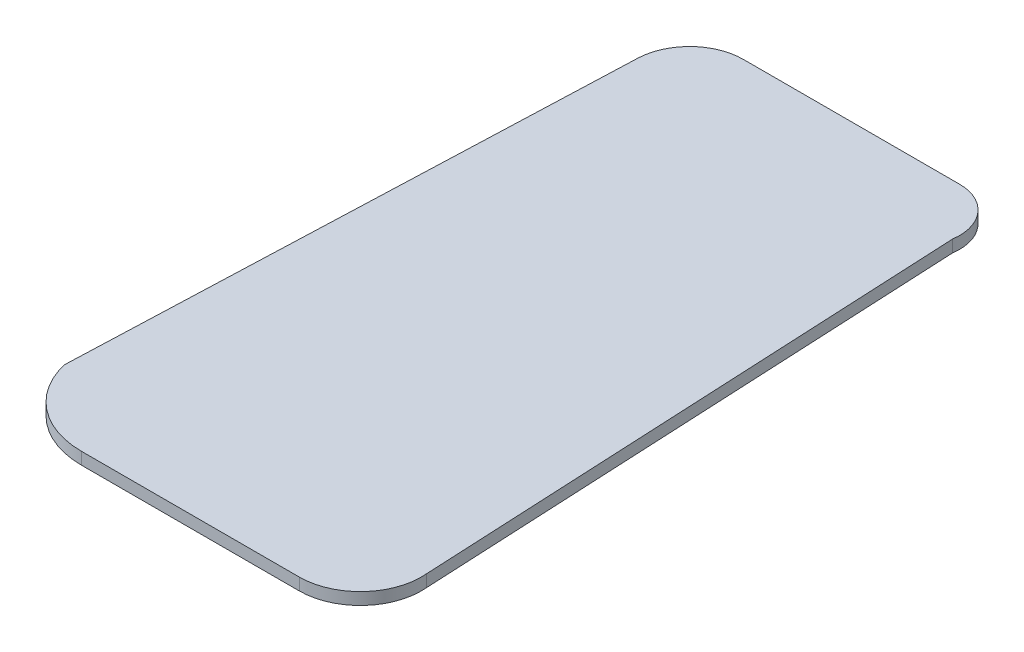
ISO-10303-21;
HEADER;
FILE_DESCRIPTION(('STEP AP214'),'2;1');
FILE_NAME('part.step','',(''),(''),'','','');
FILE_SCHEMA(('AUTOMOTIVE_DESIGN { 1 0 10303 214 1 1 1 1 }'));
ENDSEC;
DATA;
#1=APPLICATION_CONTEXT('core data for automotive mechanical design processes');
#2=APPLICATION_PROTOCOL_DEFINITION('international standard','automotive_design',2000,#1);
#3=PRODUCT_CONTEXT('',#1,'mechanical');
#4=PRODUCT('Part','Part','',(#3));
#5=PRODUCT_RELATED_PRODUCT_CATEGORY('part','',(#4));
#6=PRODUCT_DEFINITION_FORMATION('','',#4);
#7=PRODUCT_DEFINITION_CONTEXT('part definition',#1,'design');
#8=PRODUCT_DEFINITION('design','',#6,#7);
#9=PRODUCT_DEFINITION_SHAPE('','',#8);
#10=(LENGTH_UNIT() NAMED_UNIT(*) SI_UNIT(.MILLI.,.METRE.));
#11=(NAMED_UNIT(*) PLANE_ANGLE_UNIT() SI_UNIT($,.RADIAN.));
#12=(NAMED_UNIT(*) SI_UNIT($,.STERADIAN.) SOLID_ANGLE_UNIT());
#13=UNCERTAINTY_MEASURE_WITH_UNIT(LENGTH_MEASURE(1.E-05),#10,'distance_accuracy_value','');
#14=(GEOMETRIC_REPRESENTATION_CONTEXT(3) GLOBAL_UNCERTAINTY_ASSIGNED_CONTEXT((#13)) GLOBAL_UNIT_ASSIGNED_CONTEXT((#10,
#11,#12)) REPRESENTATION_CONTEXT('',''));
#15=CARTESIAN_POINT('',(0.,0.,0.));
#16=DIRECTION('',(0.,0.,1.));
#17=DIRECTION('',(1.,0.,0.));
#18=AXIS2_PLACEMENT_3D('',#15,#16,#17);
#19=CARTESIAN_POINT('',(24.8187686559189,2.54,-21.4184403435667));
#20=DIRECTION('',(0.,-1.,0.));
#21=DIRECTION('',(0.,0.,-1.));
#22=AXIS2_PLACEMENT_3D('',#19,#20,#21);
#23=CYLINDRICAL_SURFACE('',#22,18.0381220267883);
#24=CARTESIAN_POINT('',(24.8187686559189,0.,-21.4184403435667));
#25=DIRECTION('',(0.,1.,0.));
#26=DIRECTION('',(0.,0.,-1.));
#27=AXIS2_PLACEMENT_3D('',#24,#25,#26);
#28=CIRCLE('',#27,18.0381220267883);
#29=CARTESIAN_POINT('',(7.23714743262047,0.,-17.3860165794059));
#30=VERTEX_POINT('',#29);
#31=CARTESIAN_POINT('',(24.8187686559189,0.,-3.38031831677837));
#32=VERTEX_POINT('',#31);
#33=EDGE_CURVE('E191',#30,#32,#28,.T.);
#34=ORIENTED_EDGE('',*,*,#33,.T.);
#35=DIRECTION('',(0.,-1.,0.));
#36=VECTOR('',#35,1.);
#37=CARTESIAN_POINT('',(24.8187686559189,2.54,-3.38031831677837));
#38=LINE('',#37,#36);
#39=CARTESIAN_POINT('',(24.8187686559189,2.54,-3.38031831677837));
#40=VERTEX_POINT('',#39);
#41=EDGE_CURVE('E12',#40,#32,#38,.T.);
#42=ORIENTED_EDGE('',*,*,#41,.F.);
#43=CARTESIAN_POINT('',(24.8187686559189,2.54,-21.4184403435667));
#44=DIRECTION('',(0.,1.,0.));
#45=DIRECTION('',(0.,0.,-1.));
#46=AXIS2_PLACEMENT_3D('',#43,#44,#45);
#47=CIRCLE('',#46,18.0381220267883);
#48=CARTESIAN_POINT('',(7.23714743262047,2.54,-17.3860165794059));
#49=VERTEX_POINT('',#48);
#50=EDGE_CURVE('E156',#49,#40,#47,.T.);
#51=ORIENTED_EDGE('',*,*,#50,.F.);
#52=DIRECTION('',(0.,-1.,0.));
#53=VECTOR('',#52,1.);
#54=CARTESIAN_POINT('',(7.23714743262047,2.54,-17.3860165794059));
#55=LINE('',#54,#53);
#56=EDGE_CURVE('E131',#49,#30,#55,.T.);
#57=ORIENTED_EDGE('',*,*,#56,.T.);
#58=EDGE_LOOP('',(#34,#42,#51,#57));
#59=FACE_BOUND('',#58,.T.);
#60=ADVANCED_FACE('F36',(#59),#23,.T.);
#61=CARTESIAN_POINT('',(70.7097799845283,2.54,-3.38031831677837));
#62=DIRECTION('',(0.,0.,-1.));
#63=DIRECTION('',(-1.,0.,0.));
#64=AXIS2_PLACEMENT_3D('',#61,#62,#63);
#65=PLANE('',#64);
#66=DIRECTION('',(1.,0.,0.));
#67=VECTOR('',#66,1.);
#68=CARTESIAN_POINT('',(70.7097799845283,0.,-3.38031831677837));
#69=LINE('',#68,#67);
#70=CARTESIAN_POINT('',(70.7097799845283,0.,-3.38031831677836));
#71=VERTEX_POINT('',#70);
#72=EDGE_CURVE('E185',#32,#71,#69,.T.);
#73=ORIENTED_EDGE('',*,*,#72,.T.);
#74=DIRECTION('',(0.,-1.,0.));
#75=VECTOR('',#74,1.);
#76=CARTESIAN_POINT('',(70.7097799845283,2.54,-3.38031831677836));
#77=LINE('',#76,#75);
#78=CARTESIAN_POINT('',(70.7097799845283,2.54,-3.38031831677836));
#79=VERTEX_POINT('',#78);
#80=EDGE_CURVE('E44',#79,#71,#77,.T.);
#81=ORIENTED_EDGE('',*,*,#80,.F.);
#82=DIRECTION('',(1.,0.,0.));
#83=VECTOR('',#82,1.);
#84=CARTESIAN_POINT('',(70.7097799845283,2.54,-3.38031831677837));
#85=LINE('',#84,#83);
#86=EDGE_CURVE('E95',#40,#79,#85,.T.);
#87=ORIENTED_EDGE('',*,*,#86,.F.);
#88=ORIENTED_EDGE('',*,*,#41,.T.);
#89=EDGE_LOOP('',(#73,#81,#87,#88));
#90=FACE_BOUND('',#89,.T.);
#91=ADVANCED_FACE('F210',(#90),#65,.F.);
#92=CARTESIAN_POINT('',(70.7097799845283,2.54,-16.2447645706812));
#93=DIRECTION('',(0.,-1.,0.));
#94=DIRECTION('',(0.,0.,-1.));
#95=AXIS2_PLACEMENT_3D('',#92,#93,#94);
#96=CYLINDRICAL_SURFACE('',#95,12.8644462539028);
#97=CARTESIAN_POINT('',(70.7097799845283,0.,-16.2447645706812));
#98=DIRECTION('',(0.,1.,0.));
#99=DIRECTION('',(0.,0.,1.));
#100=AXIS2_PLACEMENT_3D('',#97,#98,#99);
#101=CIRCLE('',#100,12.8644462539028);
#102=CARTESIAN_POINT('',(83.5235039269322,0.,-17.3860165794059));
#103=VERTEX_POINT('',#102);
#104=EDGE_CURVE('E180',#71,#103,#101,.T.);
#105=ORIENTED_EDGE('',*,*,#104,.T.);
#106=DIRECTION('',(0.,-1.,0.));
#107=VECTOR('',#106,1.);
#108=CARTESIAN_POINT('',(83.5235039269322,2.54,-17.3860165794059));
#109=LINE('',#108,#107);
#110=CARTESIAN_POINT('',(83.5235039269322,2.54,-17.3860165794059));
#111=VERTEX_POINT('',#110);
#112=EDGE_CURVE('E172',#111,#103,#109,.T.);
#113=ORIENTED_EDGE('',*,*,#112,.F.);
#114=CARTESIAN_POINT('',(70.7097799845283,2.54,-16.2447645706812));
#115=DIRECTION('',(0.,1.,0.));
#116=DIRECTION('',(0.,0.,1.));
#117=AXIS2_PLACEMENT_3D('',#114,#115,#116);
#118=CIRCLE('',#117,12.8644462539028);
#119=EDGE_CURVE('E148',#79,#111,#118,.T.);
#120=ORIENTED_EDGE('',*,*,#119,.F.);
#121=ORIENTED_EDGE('',*,*,#80,.T.);
#122=EDGE_LOOP('',(#105,#113,#120,#121));
#123=FACE_BOUND('',#122,.T.);
#124=ADVANCED_FACE('F178',(#123),#96,.T.);
#125=CARTESIAN_POINT('',(77.86162590587,2.54,-133.901506381265));
#126=DIRECTION('',(-0.998821429969185,0.,0.0485360797171728));
#127=DIRECTION('',(0.0485360797171728,0.,0.998821429969185));
#128=AXIS2_PLACEMENT_3D('',#125,#126,#127);
#129=PLANE('',#128);
#130=DIRECTION('',(-0.0485360797171728,0.,-0.998821429969185));
#131=VECTOR('',#130,1.);
#132=CARTESIAN_POINT('',(77.86162590587,0.,-133.901506381265));
#133=LINE('',#132,#131);
#134=CARTESIAN_POINT('',(77.86162590587,0.,-133.901506381265));
#135=VERTEX_POINT('',#134);
#136=EDGE_CURVE('E187',#103,#135,#133,.T.);
#137=ORIENTED_EDGE('',*,*,#136,.T.);
#138=DIRECTION('',(0.,-1.,0.));
#139=VECTOR('',#138,1.);
#140=CARTESIAN_POINT('',(77.86162590587,2.54,-133.901506381265));
#141=LINE('',#140,#139);
#142=CARTESIAN_POINT('',(77.86162590587,2.54,-133.901506381265));
#143=VERTEX_POINT('',#142);
#144=EDGE_CURVE('E169',#143,#135,#141,.T.);
#145=ORIENTED_EDGE('',*,*,#144,.F.);
#146=DIRECTION('',(-0.0485360797171728,0.,-0.998821429969185));
#147=VECTOR('',#146,1.);
#148=CARTESIAN_POINT('',(77.86162590587,2.54,-133.901506381265));
#149=LINE('',#148,#147);
#150=EDGE_CURVE('E144',#111,#143,#149,.T.);
#151=ORIENTED_EDGE('',*,*,#150,.F.);
#152=ORIENTED_EDGE('',*,*,#112,.T.);
#153=EDGE_LOOP('',(#137,#145,#151,#152));
#154=FACE_BOUND('',#153,.T.);
#155=ADVANCED_FACE('F217',(#154),#129,.F.);
#156=CARTESIAN_POINT('',(68.623824924137,2.54,-135.28800428847));
#157=DIRECTION('',(0.,-1.,0.));
#158=DIRECTION('',(0.,0.,-1.));
#159=AXIS2_PLACEMENT_3D('',#156,#157,#158);
#160=CYLINDRICAL_SURFACE('',#159,9.34127097480801);
#161=CARTESIAN_POINT('',(68.623824924137,0.,-135.28800428847));
#162=DIRECTION('',(0.,1.,0.));
#163=DIRECTION('',(0.,0.,-1.));
#164=AXIS2_PLACEMENT_3D('',#161,#162,#163);
#165=CIRCLE('',#164,9.34127097480801);
#166=CARTESIAN_POINT('',(68.623824924137,0.,-144.629275263278));
#167=VERTEX_POINT('',#166);
#168=EDGE_CURVE('E189',#135,#167,#165,.T.);
#169=ORIENTED_EDGE('',*,*,#168,.T.);
#170=DIRECTION('',(0.,-1.,0.));
#171=VECTOR('',#170,1.);
#172=CARTESIAN_POINT('',(68.623824924137,2.54,-144.629275263278));
#173=LINE('',#172,#171);
#174=CARTESIAN_POINT('',(68.623824924137,2.54,-144.629275263278));
#175=VERTEX_POINT('',#174);
#176=EDGE_CURVE('E124',#175,#167,#173,.T.);
#177=ORIENTED_EDGE('',*,*,#176,.F.);
#178=CARTESIAN_POINT('',(68.623824924137,2.54,-135.28800428847));
#179=DIRECTION('',(0.,1.,0.));
#180=DIRECTION('',(0.,0.,-1.));
#181=AXIS2_PLACEMENT_3D('',#178,#179,#180);
#182=CIRCLE('',#181,9.34127097480801);
#183=EDGE_CURVE('E114',#143,#175,#182,.T.);
#184=ORIENTED_EDGE('',*,*,#183,.F.);
#185=ORIENTED_EDGE('',*,*,#144,.T.);
#186=EDGE_LOOP('',(#169,#177,#184,#185));
#187=FACE_BOUND('',#186,.T.);
#188=ADVANCED_FACE('F195',(#187),#160,.T.);
#189=CARTESIAN_POINT('',(23.0308071755835,2.54,-144.629275263278));
#190=DIRECTION('',(0.,0.,1.));
#191=DIRECTION('',(1.,0.,0.));
#192=AXIS2_PLACEMENT_3D('',#189,#190,#191);
#193=PLANE('',#192);
#194=DIRECTION('',(-1.,0.,0.));
#195=VECTOR('',#194,1.);
#196=CARTESIAN_POINT('',(23.0308071755835,0.,-144.629275263278));
#197=LINE('',#196,#195);
#198=CARTESIAN_POINT('',(23.0308071755835,0.,-144.629275263278));
#199=VERTEX_POINT('',#198);
#200=EDGE_CURVE('E123',#167,#199,#197,.T.);
#201=ORIENTED_EDGE('',*,*,#200,.T.);
#202=DIRECTION('',(0.,-1.,0.));
#203=VECTOR('',#202,1.);
#204=CARTESIAN_POINT('',(23.0308071755835,2.54,-144.629275263278));
#205=LINE('',#204,#203);
#206=CARTESIAN_POINT('',(23.0308071755835,2.54,-144.629275263278));
#207=VERTEX_POINT('',#206);
#208=EDGE_CURVE('E120',#207,#199,#205,.T.);
#209=ORIENTED_EDGE('',*,*,#208,.F.);
#210=DIRECTION('',(-1.,0.,0.));
#211=VECTOR('',#210,1.);
#212=CARTESIAN_POINT('',(23.0308071755835,2.54,-144.629275263278));
#213=LINE('',#212,#211);
#214=EDGE_CURVE('E108',#175,#207,#213,.T.);
#215=ORIENTED_EDGE('',*,*,#214,.F.);
#216=ORIENTED_EDGE('',*,*,#176,.T.);
#217=EDGE_LOOP('',(#201,#209,#215,#216));
#218=FACE_BOUND('',#217,.T.);
#219=ADVANCED_FACE('F121',(#218),#193,.F.);
#220=CARTESIAN_POINT('',(23.0308071755835,2.54,-133.288964022261));
#221=DIRECTION('',(0.,-1.,0.));
#222=DIRECTION('',(0.,0.,-1.));
#223=AXIS2_PLACEMENT_3D('',#220,#221,#222);
#224=CYLINDRICAL_SURFACE('',#223,11.3403112410164);
#225=CARTESIAN_POINT('',(23.0308071755835,0.,-133.288964022261));
#226=DIRECTION('',(0.,1.,0.));
#227=DIRECTION('',(0.,0.,1.));
#228=AXIS2_PLACEMENT_3D('',#225,#226,#227);
#229=CIRCLE('',#228,11.3403112410164);
#230=CARTESIAN_POINT('',(11.707051133459,0.,-133.901506381265));
#231=VERTEX_POINT('',#230);
#232=EDGE_CURVE('E81',#199,#231,#229,.T.);
#233=ORIENTED_EDGE('',*,*,#232,.T.);
#234=DIRECTION('',(0.,-1.,0.));
#235=VECTOR('',#234,1.);
#236=CARTESIAN_POINT('',(11.707051133459,2.54,-133.901506381265));
#237=LINE('',#236,#235);
#238=CARTESIAN_POINT('',(11.707051133459,2.54,-133.901506381265));
#239=VERTEX_POINT('',#238);
#240=EDGE_CURVE('E125',#239,#231,#237,.T.);
#241=ORIENTED_EDGE('',*,*,#240,.F.);
#242=CARTESIAN_POINT('',(23.0308071755835,2.54,-133.288964022261));
#243=DIRECTION('',(0.,1.,0.));
#244=DIRECTION('',(0.,0.,1.));
#245=AXIS2_PLACEMENT_3D('',#242,#243,#244);
#246=CIRCLE('',#245,11.3403112410164);
#247=EDGE_CURVE('E112',#207,#239,#246,.T.);
#248=ORIENTED_EDGE('',*,*,#247,.F.);
#249=ORIENTED_EDGE('',*,*,#208,.T.);
#250=EDGE_LOOP('',(#233,#241,#248,#249));
#251=FACE_BOUND('',#250,.T.);
#252=ADVANCED_FACE('F127',(#251),#224,.T.);
#253=CARTESIAN_POINT('',(7.23714743262047,2.54,-17.3860165794059));
#254=DIRECTION('',(0.999264944796044,0.,0.0383349723067536));
#255=DIRECTION('',(0.0383349723067536,0.,-0.999264944796044));
#256=AXIS2_PLACEMENT_3D('',#253,#254,#255);
#257=PLANE('',#256);
#258=DIRECTION('',(-0.0383349723067536,0.,0.999264944796044));
#259=VECTOR('',#258,1.);
#260=CARTESIAN_POINT('',(7.23714743262047,0.,-17.3860165794059));
#261=LINE('',#260,#259);
#262=EDGE_CURVE('E87',#231,#30,#261,.T.);
#263=ORIENTED_EDGE('',*,*,#262,.T.);
#264=ORIENTED_EDGE('',*,*,#56,.F.);
#265=DIRECTION('',(-0.0383349723067536,0.,0.999264944796044));
#266=VECTOR('',#265,1.);
#267=CARTESIAN_POINT('',(7.23714743262047,2.54,-17.3860165794059));
#268=LINE('',#267,#266);
#269=EDGE_CURVE('E52',#239,#49,#268,.T.);
#270=ORIENTED_EDGE('',*,*,#269,.F.);
#271=ORIENTED_EDGE('',*,*,#240,.T.);
#272=EDGE_LOOP('',(#263,#264,#270,#271));
#273=FACE_BOUND('',#272,.T.);
#274=ADVANCED_FACE('F199',(#273),#257,.F.);
#275=CARTESIAN_POINT('',(24.8187686559189,2.54,-21.4184403435667));
#276=DIRECTION('',(0.,-1.,0.));
#277=DIRECTION('',(0.,0.,-1.));
#278=AXIS2_PLACEMENT_3D('',#275,#276,#277);
#279=PLANE('',#278);
#280=ORIENTED_EDGE('',*,*,#50,.T.);
#281=ORIENTED_EDGE('',*,*,#86,.T.);
#282=ORIENTED_EDGE('',*,*,#119,.T.);
#283=ORIENTED_EDGE('',*,*,#150,.T.);
#284=ORIENTED_EDGE('',*,*,#183,.T.);
#285=ORIENTED_EDGE('',*,*,#214,.T.);
#286=ORIENTED_EDGE('',*,*,#247,.T.);
#287=ORIENTED_EDGE('',*,*,#269,.T.);
#288=EDGE_LOOP('',(#280,#281,#282,#283,#284,#285,#286,#287));
#289=FACE_BOUND('',#288,.T.);
#290=ADVANCED_FACE('F110',(#289),#279,.F.);
#291=CARTESIAN_POINT('',(24.8187686559189,0.,-21.4184403435667));
#292=DIRECTION('',(0.,-1.,0.));
#293=DIRECTION('',(0.,0.,-1.));
#294=AXIS2_PLACEMENT_3D('',#291,#292,#293);
#295=PLANE('',#294);
#296=ORIENTED_EDGE('',*,*,#33,.F.);
#297=ORIENTED_EDGE('',*,*,#262,.F.);
#298=ORIENTED_EDGE('',*,*,#232,.F.);
#299=ORIENTED_EDGE('',*,*,#200,.F.);
#300=ORIENTED_EDGE('',*,*,#168,.F.);
#301=ORIENTED_EDGE('',*,*,#136,.F.);
#302=ORIENTED_EDGE('',*,*,#104,.F.);
#303=ORIENTED_EDGE('',*,*,#72,.F.);
#304=EDGE_LOOP('',(#296,#297,#298,#299,#300,#301,#302,#303));
#305=FACE_BOUND('',#304,.T.);
#306=ADVANCED_FACE('F184',(#305),#295,.T.);
#307=CLOSED_SHELL('',(#60,#91,#124,#155,#188,#219,#252,#274,#290,#306));
#308=MANIFOLD_SOLID_BREP('B2',#307);
#309=ADVANCED_BREP_SHAPE_REPRESENTATION('',(#18,#308),#14);
#310=SHAPE_DEFINITION_REPRESENTATION(#9,#309);
ENDSEC;
END-ISO-10303-21;
